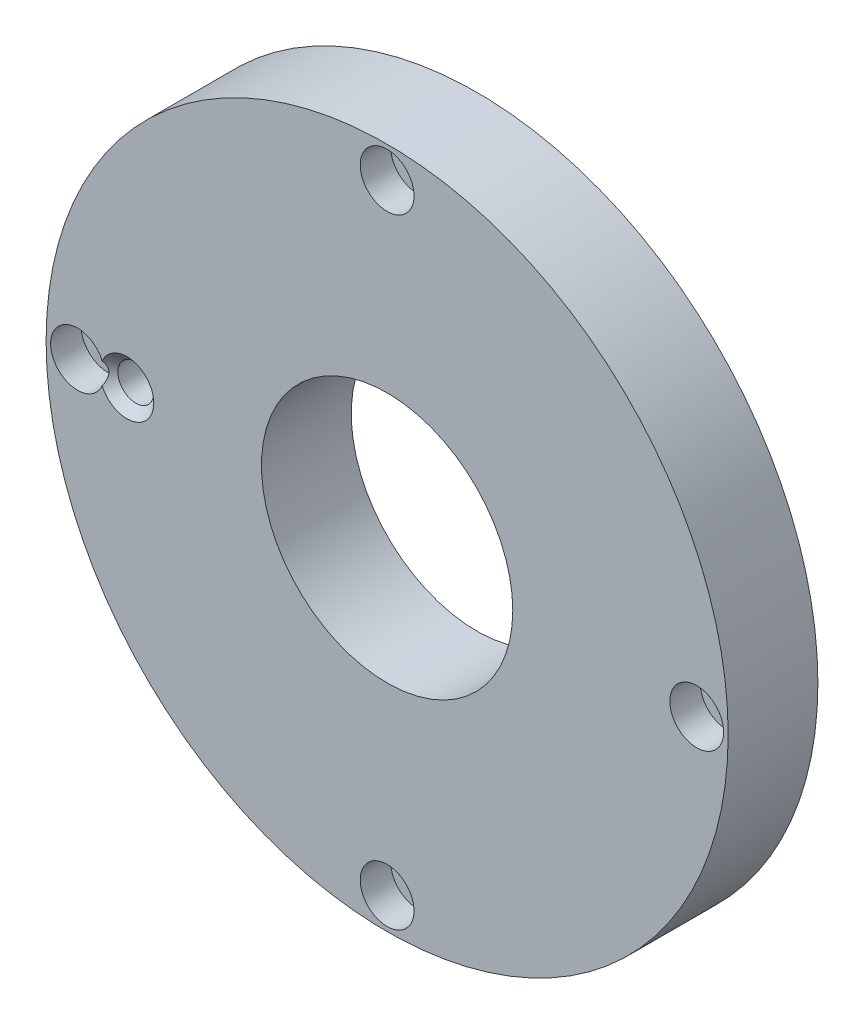
ISO-10303-21;
HEADER;
FILE_DESCRIPTION(('STEP AP214'),'2;1');
FILE_NAME('part.step','',(''),(''),'','','');
FILE_SCHEMA(('AUTOMOTIVE_DESIGN { 1 0 10303 214 1 1 1 1 }'));
ENDSEC;
DATA;
#1=APPLICATION_CONTEXT('core data for automotive mechanical design processes');
#2=APPLICATION_PROTOCOL_DEFINITION('international standard','automotive_design',2000,#1);
#3=PRODUCT_CONTEXT('',#1,'mechanical');
#4=PRODUCT('Part','Part','',(#3));
#5=PRODUCT_RELATED_PRODUCT_CATEGORY('part','',(#4));
#6=PRODUCT_DEFINITION_FORMATION('','',#4);
#7=PRODUCT_DEFINITION_CONTEXT('part definition',#1,'design');
#8=PRODUCT_DEFINITION('design','',#6,#7);
#9=PRODUCT_DEFINITION_SHAPE('','',#8);
#10=(LENGTH_UNIT() NAMED_UNIT(*) SI_UNIT(.MILLI.,.METRE.));
#11=(NAMED_UNIT(*) PLANE_ANGLE_UNIT() SI_UNIT($,.RADIAN.));
#12=(NAMED_UNIT(*) SI_UNIT($,.STERADIAN.) SOLID_ANGLE_UNIT());
#13=UNCERTAINTY_MEASURE_WITH_UNIT(LENGTH_MEASURE(1.E-05),#10,'distance_accuracy_value','');
#14=(GEOMETRIC_REPRESENTATION_CONTEXT(3) GLOBAL_UNCERTAINTY_ASSIGNED_CONTEXT((#13)) GLOBAL_UNIT_ASSIGNED_CONTEXT((#10,
#11,#12)) REPRESENTATION_CONTEXT('',''));
#15=CARTESIAN_POINT('',(0.,0.,0.));
#16=DIRECTION('',(0.,0.,1.));
#17=DIRECTION('',(1.,0.,0.));
#18=AXIS2_PLACEMENT_3D('',#15,#16,#17);
#19=CARTESIAN_POINT('',(0.,0.,9.99999999999999));
#20=DIRECTION('',(0.,0.,1.));
#21=DIRECTION('',(1.,0.,0.));
#22=AXIS2_PLACEMENT_3D('',#19,#20,#21);
#23=PLANE('',#22);
#24=CARTESIAN_POINT('',(0.,34.5,9.99999999999999));
#25=DIRECTION('',(0.,0.,1.));
#26=DIRECTION('',(1.,0.,0.));
#27=AXIS2_PLACEMENT_3D('',#24,#25,#26);
#28=CIRCLE('',#27,3.);
#29=CARTESIAN_POINT('',(2.99999999999999,34.5,9.99999999999999));
#30=VERTEX_POINT('',#29);
#31=EDGE_CURVE('E150',#30,#30,#28,.T.);
#32=ORIENTED_EDGE('',*,*,#31,.F.);
#33=EDGE_LOOP('',(#32));
#34=FACE_BOUND('',#33,.T.);
#35=CARTESIAN_POINT('',(34.5,0.,9.99999999999999));
#36=DIRECTION('',(0.,0.,1.));
#37=DIRECTION('',(1.,0.,0.));
#38=AXIS2_PLACEMENT_3D('',#35,#36,#37);
#39=CIRCLE('',#38,3.);
#40=CARTESIAN_POINT('',(37.5,0.,9.99999999999999));
#41=VERTEX_POINT('',#40);
#42=EDGE_CURVE('E137',#41,#41,#39,.T.);
#43=ORIENTED_EDGE('',*,*,#42,.F.);
#44=EDGE_LOOP('',(#43));
#45=FACE_BOUND('',#44,.T.);
#46=CARTESIAN_POINT('',(0.,-34.5,9.99999999999999));
#47=DIRECTION('',(0.,0.,1.));
#48=DIRECTION('',(1.,0.,0.));
#49=AXIS2_PLACEMENT_3D('',#46,#47,#48);
#50=CIRCLE('',#49,3.);
#51=CARTESIAN_POINT('',(3.,-34.5,9.99999999999999));
#52=VERTEX_POINT('',#51);
#53=EDGE_CURVE('E122',#52,#52,#50,.T.);
#54=ORIENTED_EDGE('',*,*,#53,.F.);
#55=EDGE_LOOP('',(#54));
#56=FACE_BOUND('',#55,.T.);
#57=CARTESIAN_POINT('',(-34.5,0.,9.99999999999999));
#58=DIRECTION('',(0.,0.,1.));
#59=DIRECTION('',(1.,0.,0.));
#60=AXIS2_PLACEMENT_3D('',#57,#58,#59);
#61=CIRCLE('',#60,3.);
#62=CARTESIAN_POINT('',(-31.75,1.19895788082824,9.99999999999999));
#63=VERTEX_POINT('',#62);
#64=CARTESIAN_POINT('',(-31.75,-1.19895788082813,9.99999999999999));
#65=VERTEX_POINT('',#64);
#66=EDGE_CURVE('E73',#63,#65,#61,.T.);
#67=ORIENTED_EDGE('',*,*,#66,.F.);
#68=CARTESIAN_POINT('',(-29.,1.11907385979033E-13,9.99999999999999));
#69=DIRECTION('',(0.,0.,1.));
#70=DIRECTION('',(1.,0.,0.));
#71=AXIS2_PLACEMENT_3D('',#68,#69,#70);
#72=CIRCLE('',#71,3.00000000000001);
#73=EDGE_CURVE('E63',#63,#65,#72,.F.);
#74=ORIENTED_EDGE('',*,*,#73,.T.);
#75=EDGE_LOOP('',(#67,#74));
#76=FACE_BOUND('',#75,.T.);
#77=CARTESIAN_POINT('',(0.,0.,9.99999999999999));
#78=DIRECTION('',(0.,0.,1.));
#79=DIRECTION('',(1.,0.,0.));
#80=AXIS2_PLACEMENT_3D('',#77,#78,#79);
#81=CIRCLE('',#80,38.);
#82=CARTESIAN_POINT('',(38.,0.,9.99999999999999));
#83=VERTEX_POINT('',#82);
#84=EDGE_CURVE('E90',#83,#83,#81,.T.);
#85=ORIENTED_EDGE('',*,*,#84,.T.);
#86=EDGE_LOOP('',(#85));
#87=FACE_BOUND('',#86,.T.);
#88=CARTESIAN_POINT('',(0.,0.,9.99999999999999));
#89=DIRECTION('',(0.,0.,1.));
#90=DIRECTION('',(1.,0.,0.));
#91=AXIS2_PLACEMENT_3D('',#88,#89,#90);
#92=CIRCLE('',#91,14.);
#93=CARTESIAN_POINT('',(14.,0.,9.99999999999999));
#94=VERTEX_POINT('',#93);
#95=EDGE_CURVE('E95',#94,#94,#92,.T.);
#96=ORIENTED_EDGE('',*,*,#95,.F.);
#97=EDGE_LOOP('',(#96));
#98=FACE_BOUND('',#97,.T.);
#99=ADVANCED_FACE('F50',(#34,#45,#56,#76,#87,#98),#23,.T.);
#100=CARTESIAN_POINT('',(0.,0.,0.));
#101=DIRECTION('',(0.,0.,1.));
#102=DIRECTION('',(1.,0.,0.));
#103=AXIS2_PLACEMENT_3D('',#100,#101,#102);
#104=PLANE('',#103);
#105=CARTESIAN_POINT('',(-29.,1.11907385979033E-13,0.));
#106=DIRECTION('',(0.,0.,1.));
#107=DIRECTION('',(1.,0.,0.));
#108=AXIS2_PLACEMENT_3D('',#105,#106,#107);
#109=CIRCLE('',#108,3.);
#110=CARTESIAN_POINT('',(-26.,1.11907385979033E-13,0.));
#111=VERTEX_POINT('',#110);
#112=EDGE_CURVE('E80',#111,#111,#109,.T.);
#113=ORIENTED_EDGE('',*,*,#112,.T.);
#114=EDGE_LOOP('',(#113));
#115=FACE_BOUND('',#114,.T.);
#116=CARTESIAN_POINT('',(0.,34.5,0.));
#117=DIRECTION('',(0.,0.,1.));
#118=DIRECTION('',(1.,0.,0.));
#119=AXIS2_PLACEMENT_3D('',#116,#117,#118);
#120=CIRCLE('',#119,1.6);
#121=CARTESIAN_POINT('',(1.59999999999999,34.5,0.));
#122=VERTEX_POINT('',#121);
#123=EDGE_CURVE('E141',#122,#122,#120,.T.);
#124=ORIENTED_EDGE('',*,*,#123,.T.);
#125=EDGE_LOOP('',(#124));
#126=FACE_BOUND('',#125,.T.);
#127=CARTESIAN_POINT('',(34.5,0.,0.));
#128=DIRECTION('',(0.,0.,1.));
#129=DIRECTION('',(1.,0.,0.));
#130=AXIS2_PLACEMENT_3D('',#127,#128,#129);
#131=CIRCLE('',#130,1.6);
#132=CARTESIAN_POINT('',(36.1,0.,0.));
#133=VERTEX_POINT('',#132);
#134=EDGE_CURVE('E125',#133,#133,#131,.T.);
#135=ORIENTED_EDGE('',*,*,#134,.T.);
#136=EDGE_LOOP('',(#135));
#137=FACE_BOUND('',#136,.T.);
#138=CARTESIAN_POINT('',(0.,-34.5,0.));
#139=DIRECTION('',(0.,0.,1.));
#140=DIRECTION('',(1.,0.,0.));
#141=AXIS2_PLACEMENT_3D('',#138,#139,#140);
#142=CIRCLE('',#141,1.6);
#143=CARTESIAN_POINT('',(1.60000000000001,-34.5,0.));
#144=VERTEX_POINT('',#143);
#145=EDGE_CURVE('E77',#144,#144,#142,.T.);
#146=ORIENTED_EDGE('',*,*,#145,.T.);
#147=EDGE_LOOP('',(#146));
#148=FACE_BOUND('',#147,.T.);
#149=CARTESIAN_POINT('',(-34.5,0.,0.));
#150=DIRECTION('',(0.,0.,1.));
#151=DIRECTION('',(1.,0.,0.));
#152=AXIS2_PLACEMENT_3D('',#149,#150,#151);
#153=CIRCLE('',#152,1.6);
#154=CARTESIAN_POINT('',(-32.9,0.,0.));
#155=VERTEX_POINT('',#154);
#156=EDGE_CURVE('E103',#155,#155,#153,.T.);
#157=ORIENTED_EDGE('',*,*,#156,.T.);
#158=EDGE_LOOP('',(#157));
#159=FACE_BOUND('',#158,.T.);
#160=CARTESIAN_POINT('',(0.,0.,0.));
#161=DIRECTION('',(0.,0.,1.));
#162=DIRECTION('',(1.,0.,0.));
#163=AXIS2_PLACEMENT_3D('',#160,#161,#162);
#164=CIRCLE('',#163,38.);
#165=CARTESIAN_POINT('',(38.,0.,0.));
#166=VERTEX_POINT('',#165);
#167=EDGE_CURVE('E91',#166,#166,#164,.T.);
#168=ORIENTED_EDGE('',*,*,#167,.F.);
#169=EDGE_LOOP('',(#168));
#170=FACE_BOUND('',#169,.T.);
#171=CARTESIAN_POINT('',(0.,0.,0.));
#172=DIRECTION('',(0.,0.,1.));
#173=DIRECTION('',(1.,0.,0.));
#174=AXIS2_PLACEMENT_3D('',#171,#172,#173);
#175=CIRCLE('',#174,14.);
#176=CARTESIAN_POINT('',(14.,0.,0.));
#177=VERTEX_POINT('',#176);
#178=EDGE_CURVE('E99',#177,#177,#175,.T.);
#179=ORIENTED_EDGE('',*,*,#178,.T.);
#180=EDGE_LOOP('',(#179));
#181=FACE_BOUND('',#180,.T.);
#182=ADVANCED_FACE('F158',(#115,#126,#137,#148,#159,#170,#181),#104,.F.);
#183=CARTESIAN_POINT('',(0.,0.,9.99999999999999));
#184=DIRECTION('',(0.,0.,-1.));
#185=DIRECTION('',(-1.,0.,0.));
#186=AXIS2_PLACEMENT_3D('',#183,#184,#185);
#187=CYLINDRICAL_SURFACE('',#186,38.);
#188=ORIENTED_EDGE('',*,*,#84,.F.);
#189=EDGE_LOOP('',(#188));
#190=FACE_BOUND('',#189,.T.);
#191=ORIENTED_EDGE('',*,*,#167,.T.);
#192=EDGE_LOOP('',(#191));
#193=FACE_BOUND('',#192,.T.);
#194=ADVANCED_FACE('F199',(#190,#193),#187,.T.);
#195=CARTESIAN_POINT('',(0.,0.,9.99999999999999));
#196=DIRECTION('',(0.,0.,-1.));
#197=DIRECTION('',(-1.,0.,0.));
#198=AXIS2_PLACEMENT_3D('',#195,#196,#197);
#199=CYLINDRICAL_SURFACE('',#198,14.);
#200=ORIENTED_EDGE('',*,*,#95,.T.);
#201=EDGE_LOOP('',(#200));
#202=FACE_BOUND('',#201,.T.);
#203=ORIENTED_EDGE('',*,*,#178,.F.);
#204=EDGE_LOOP('',(#203));
#205=FACE_BOUND('',#204,.T.);
#206=ADVANCED_FACE('F196',(#202,#205),#199,.F.);
#207=CARTESIAN_POINT('',(-34.5,0.,9.99999999999999));
#208=DIRECTION('',(0.,0.,1.));
#209=DIRECTION('',(1.,0.,0.));
#210=AXIS2_PLACEMENT_3D('',#207,#208,#209);
#211=CYLINDRICAL_SURFACE('',#210,1.6);
#212=ORIENTED_EDGE('',*,*,#156,.F.);
#213=EDGE_LOOP('',(#212));
#214=FACE_BOUND('',#213,.T.);
#215=CARTESIAN_POINT('',(-34.5,0.,6.6));
#216=DIRECTION('',(0.,0.,1.));
#217=DIRECTION('',(1.,0.,0.));
#218=AXIS2_PLACEMENT_3D('',#215,#216,#217);
#219=CIRCLE('',#218,1.6);
#220=CARTESIAN_POINT('',(-32.9,0.,6.6));
#221=VERTEX_POINT('',#220);
#222=EDGE_CURVE('E109',#221,#221,#219,.T.);
#223=ORIENTED_EDGE('',*,*,#222,.T.);
#224=EDGE_LOOP('',(#223));
#225=FACE_BOUND('',#224,.T.);
#226=ADVANCED_FACE('F192',(#214,#225),#211,.F.);
#227=CARTESIAN_POINT('',(-32.9,0.,6.6));
#228=DIRECTION('',(0.,0.,-1.));
#229=DIRECTION('',(-1.,0.,0.));
#230=AXIS2_PLACEMENT_3D('',#227,#228,#229);
#231=PLANE('',#230);
#232=ORIENTED_EDGE('',*,*,#222,.F.);
#233=EDGE_LOOP('',(#232));
#234=FACE_BOUND('',#233,.T.);
#235=CARTESIAN_POINT('',(-34.5,0.,6.6));
#236=DIRECTION('',(0.,0.,1.));
#237=DIRECTION('',(1.,0.,0.));
#238=AXIS2_PLACEMENT_3D('',#235,#236,#237);
#239=CIRCLE('',#238,3.);
#240=CARTESIAN_POINT('',(-31.5,0.,6.6));
#241=VERTEX_POINT('',#240);
#242=EDGE_CURVE('E76',#241,#241,#239,.T.);
#243=ORIENTED_EDGE('',*,*,#242,.T.);
#244=EDGE_LOOP('',(#243));
#245=FACE_BOUND('',#244,.T.);
#246=ADVANCED_FACE('F188',(#234,#245),#231,.F.);
#247=CARTESIAN_POINT('',(-34.5,0.,9.99999999999999));
#248=DIRECTION('',(0.,0.,1.));
#249=DIRECTION('',(1.,0.,0.));
#250=AXIS2_PLACEMENT_3D('',#247,#248,#249);
#251=CYLINDRICAL_SURFACE('',#250,3.);
#252=ORIENTED_EDGE('',*,*,#242,.F.);
#253=EDGE_LOOP('',(#252));
#254=FACE_BOUND('',#253,.T.);
#255=ORIENTED_EDGE('',*,*,#66,.T.);
#256=CARTESIAN_POINT('',(-31.75,-1.19895788082813,9.99999999999999));
#257=CARTESIAN_POINT('',(-31.726282421276,-1.14451031438282,9.95654557875701));
#258=CARTESIAN_POINT('',(-31.703756846476,-1.08847529056734,9.91427618141167));
#259=CARTESIAN_POINT('',(-31.6613033558524,-0.972459980553774,9.83301221437201));
#260=CARTESIAN_POINT('',(-31.6413966642107,-0.912452756905957,9.79404521592145));
#261=CARTESIAN_POINT('',(-31.6043762784548,-0.787215590416863,9.72020955968701));
#262=CARTESIAN_POINT('',(-31.5873317835577,-0.721901135193856,9.68544694628765));
#263=CARTESIAN_POINT('',(-31.5572359413984,-0.587263848906571,9.62308297816465));
#264=CARTESIAN_POINT('',(-31.544171254745,-0.517955355112338,9.59545774895238));
#265=CARTESIAN_POINT('',(-31.5229021367114,-0.376686320745385,9.54998824491058));
#266=CARTESIAN_POINT('',(-31.5146203274923,-0.304789236299476,9.5319886225149));
#267=CARTESIAN_POINT('',(-31.5033458729325,-0.159185095826338,9.50738199903278));
#268=CARTESIAN_POINT('',(-31.500311215712,-0.0854972523727989,9.50068451666226));
#269=CARTESIAN_POINT('',(-31.4997333684147,0.0623648987749194,9.49941356814515));
#270=CARTESIAN_POINT('',(-31.5022164492814,0.136539849993255,9.50489810271766));
#271=CARTESIAN_POINT('',(-31.5124647301429,0.282934587214905,9.52729683383611));
#272=CARTESIAN_POINT('',(-31.5202476362083,0.355146972895448,9.5442493422329));
#273=CARTESIAN_POINT('',(-31.5442627528369,0.522747928883509,9.59572013187333));
#274=CARTESIAN_POINT('',(-31.5625825695954,0.616506932981358,9.63446679842723));
#275=CARTESIAN_POINT('',(-31.6061520191139,0.796413446814046,9.72390617238591));
#276=CARTESIAN_POINT('',(-31.6314212594497,0.882538494590868,9.77463262228639));
#277=CARTESIAN_POINT('',(-31.6733220519029,1.00585132908274,9.85609495327007));
#278=CARTESIAN_POINT('',(-31.6878502614829,1.0457408267745,9.88395053236481));
#279=CARTESIAN_POINT('',(-31.718066062444,1.12364340427253,9.94100947964152));
#280=CARTESIAN_POINT('',(-31.7337452080078,1.16166729097562,9.97020253441909));
#281=CARTESIAN_POINT('',(-31.75,1.19895788082823,9.99999999999999));
#282=B_SPLINE_CURVE_WITH_KNOTS('',3,(#256,#257,#258,#259,#260,#261,#262,#263,#264,#265,#266,
#267,#268,#269,#270,#271,#272,#273,#274,#275,#276,#277,#278,#279,#280,#281),.UNSPECIFIED.,.F.,
.F.,(4,2,2,2,2,2,2,2,2,2,2,2,4),(0.,0.220867171262522,0.443426516246039,0.670767709338738,
0.897338303854697,1.12013258538007,1.34113463504552,1.56319116865907,1.78599322954117,
2.09352361439583,2.401930749334,2.5542078225582,2.70546173989332),.UNSPECIFIED.);
#283=EDGE_CURVE('E13',#65,#63,#282,.T.);
#284=ORIENTED_EDGE('',*,*,#283,.T.);
#285=EDGE_LOOP('',(#255,#284));
#286=FACE_BOUND('',#285,.T.);
#287=ADVANCED_FACE('F72',(#254,#286),#251,.F.);
#288=CARTESIAN_POINT('',(0.,-34.5,9.99999999999999));
#289=DIRECTION('',(0.,0.,1.));
#290=DIRECTION('',(1.,0.,0.));
#291=AXIS2_PLACEMENT_3D('',#288,#289,#290);
#292=CYLINDRICAL_SURFACE('',#291,1.6);
#293=ORIENTED_EDGE('',*,*,#145,.F.);
#294=EDGE_LOOP('',(#293));
#295=FACE_BOUND('',#294,.T.);
#296=CARTESIAN_POINT('',(0.,-34.5,6.6));
#297=DIRECTION('',(0.,0.,1.));
#298=DIRECTION('',(1.,0.,0.));
#299=AXIS2_PLACEMENT_3D('',#296,#297,#298);
#300=CIRCLE('',#299,1.6);
#301=CARTESIAN_POINT('',(1.60000000000001,-34.5,6.6));
#302=VERTEX_POINT('',#301);
#303=EDGE_CURVE('E116',#302,#302,#300,.T.);
#304=ORIENTED_EDGE('',*,*,#303,.T.);
#305=EDGE_LOOP('',(#304));
#306=FACE_BOUND('',#305,.T.);
#307=ADVANCED_FACE('F177',(#295,#306),#292,.F.);
#308=CARTESIAN_POINT('',(1.60000000000001,-34.5,6.6));
#309=DIRECTION('',(0.,0.,-1.));
#310=DIRECTION('',(-1.,0.,0.));
#311=AXIS2_PLACEMENT_3D('',#308,#309,#310);
#312=PLANE('',#311);
#313=ORIENTED_EDGE('',*,*,#303,.F.);
#314=EDGE_LOOP('',(#313));
#315=FACE_BOUND('',#314,.T.);
#316=CARTESIAN_POINT('',(0.,-34.5,6.6));
#317=DIRECTION('',(0.,0.,1.));
#318=DIRECTION('',(1.,0.,0.));
#319=AXIS2_PLACEMENT_3D('',#316,#317,#318);
#320=CIRCLE('',#319,3.);
#321=CARTESIAN_POINT('',(3.,-34.5,6.6));
#322=VERTEX_POINT('',#321);
#323=EDGE_CURVE('E119',#322,#322,#320,.T.);
#324=ORIENTED_EDGE('',*,*,#323,.T.);
#325=EDGE_LOOP('',(#324));
#326=FACE_BOUND('',#325,.T.);
#327=ADVANCED_FACE('F167',(#315,#326),#312,.F.);
#328=CARTESIAN_POINT('',(0.,-34.5,9.99999999999999));
#329=DIRECTION('',(0.,0.,1.));
#330=DIRECTION('',(1.,0.,0.));
#331=AXIS2_PLACEMENT_3D('',#328,#329,#330);
#332=CYLINDRICAL_SURFACE('',#331,3.);
#333=ORIENTED_EDGE('',*,*,#323,.F.);
#334=EDGE_LOOP('',(#333));
#335=FACE_BOUND('',#334,.T.);
#336=ORIENTED_EDGE('',*,*,#53,.T.);
#337=EDGE_LOOP('',(#336));
#338=FACE_BOUND('',#337,.T.);
#339=ADVANCED_FACE('F164',(#335,#338),#332,.F.);
#340=CARTESIAN_POINT('',(34.5,0.,9.99999999999999));
#341=DIRECTION('',(0.,0.,1.));
#342=DIRECTION('',(1.,0.,0.));
#343=AXIS2_PLACEMENT_3D('',#340,#341,#342);
#344=CYLINDRICAL_SURFACE('',#343,1.6);
#345=ORIENTED_EDGE('',*,*,#134,.F.);
#346=EDGE_LOOP('',(#345));
#347=FACE_BOUND('',#346,.T.);
#348=CARTESIAN_POINT('',(34.5,0.,6.6));
#349=DIRECTION('',(0.,0.,1.));
#350=DIRECTION('',(1.,0.,0.));
#351=AXIS2_PLACEMENT_3D('',#348,#349,#350);
#352=CIRCLE('',#351,1.6);
#353=CARTESIAN_POINT('',(36.1,0.,6.6));
#354=VERTEX_POINT('',#353);
#355=EDGE_CURVE('E129',#354,#354,#352,.T.);
#356=ORIENTED_EDGE('',*,*,#355,.T.);
#357=EDGE_LOOP('',(#356));
#358=FACE_BOUND('',#357,.T.);
#359=ADVANCED_FACE('F166',(#347,#358),#344,.F.);
#360=CARTESIAN_POINT('',(36.1,0.,6.6));
#361=DIRECTION('',(0.,0.,-1.));
#362=DIRECTION('',(-1.,0.,0.));
#363=AXIS2_PLACEMENT_3D('',#360,#361,#362);
#364=PLANE('',#363);
#365=ORIENTED_EDGE('',*,*,#355,.F.);
#366=EDGE_LOOP('',(#365));
#367=FACE_BOUND('',#366,.T.);
#368=CARTESIAN_POINT('',(34.5,0.,6.6));
#369=DIRECTION('',(0.,0.,1.));
#370=DIRECTION('',(1.,0.,0.));
#371=AXIS2_PLACEMENT_3D('',#368,#369,#370);
#372=CIRCLE('',#371,3.);
#373=CARTESIAN_POINT('',(37.5,0.,6.6));
#374=VERTEX_POINT('',#373);
#375=EDGE_CURVE('E133',#374,#374,#372,.T.);
#376=ORIENTED_EDGE('',*,*,#375,.T.);
#377=EDGE_LOOP('',(#376));
#378=FACE_BOUND('',#377,.T.);
#379=ADVANCED_FACE('F174',(#367,#378),#364,.F.);
#380=CARTESIAN_POINT('',(34.5,0.,9.99999999999999));
#381=DIRECTION('',(0.,0.,1.));
#382=DIRECTION('',(1.,0.,0.));
#383=AXIS2_PLACEMENT_3D('',#380,#381,#382);
#384=CYLINDRICAL_SURFACE('',#383,3.);
#385=ORIENTED_EDGE('',*,*,#375,.F.);
#386=EDGE_LOOP('',(#385));
#387=FACE_BOUND('',#386,.T.);
#388=ORIENTED_EDGE('',*,*,#42,.T.);
#389=EDGE_LOOP('',(#388));
#390=FACE_BOUND('',#389,.T.);
#391=ADVANCED_FACE('F248',(#387,#390),#384,.F.);
#392=CARTESIAN_POINT('',(0.,34.5,9.99999999999999));
#393=DIRECTION('',(0.,0.,1.));
#394=DIRECTION('',(1.,0.,0.));
#395=AXIS2_PLACEMENT_3D('',#392,#393,#394);
#396=CYLINDRICAL_SURFACE('',#395,1.6);
#397=ORIENTED_EDGE('',*,*,#123,.F.);
#398=EDGE_LOOP('',(#397));
#399=FACE_BOUND('',#398,.T.);
#400=CARTESIAN_POINT('',(0.,34.5,6.6));
#401=DIRECTION('',(0.,0.,1.));
#402=DIRECTION('',(1.,0.,0.));
#403=AXIS2_PLACEMENT_3D('',#400,#401,#402);
#404=CIRCLE('',#403,1.6);
#405=CARTESIAN_POINT('',(1.59999999999999,34.5,6.6));
#406=VERTEX_POINT('',#405);
#407=EDGE_CURVE('E144',#406,#406,#404,.T.);
#408=ORIENTED_EDGE('',*,*,#407,.T.);
#409=EDGE_LOOP('',(#408));
#410=FACE_BOUND('',#409,.T.);
#411=ADVANCED_FACE('F253',(#399,#410),#396,.F.);
#412=CARTESIAN_POINT('',(1.59999999999999,34.5,6.6));
#413=DIRECTION('',(0.,0.,-1.));
#414=DIRECTION('',(-1.,0.,0.));
#415=AXIS2_PLACEMENT_3D('',#412,#413,#414);
#416=PLANE('',#415);
#417=ORIENTED_EDGE('',*,*,#407,.F.);
#418=EDGE_LOOP('',(#417));
#419=FACE_BOUND('',#418,.T.);
#420=CARTESIAN_POINT('',(0.,34.5,6.6));
#421=DIRECTION('',(0.,0.,1.));
#422=DIRECTION('',(1.,0.,0.));
#423=AXIS2_PLACEMENT_3D('',#420,#421,#422);
#424=CIRCLE('',#423,3.);
#425=CARTESIAN_POINT('',(2.99999999999999,34.5,6.6));
#426=VERTEX_POINT('',#425);
#427=EDGE_CURVE('E147',#426,#426,#424,.T.);
#428=ORIENTED_EDGE('',*,*,#427,.T.);
#429=EDGE_LOOP('',(#428));
#430=FACE_BOUND('',#429,.T.);
#431=ADVANCED_FACE('F258',(#419,#430),#416,.F.);
#432=CARTESIAN_POINT('',(0.,34.5,9.99999999999999));
#433=DIRECTION('',(0.,0.,1.));
#434=DIRECTION('',(1.,0.,0.));
#435=AXIS2_PLACEMENT_3D('',#432,#433,#434);
#436=CYLINDRICAL_SURFACE('',#435,3.);
#437=ORIENTED_EDGE('',*,*,#427,.F.);
#438=EDGE_LOOP('',(#437));
#439=FACE_BOUND('',#438,.T.);
#440=ORIENTED_EDGE('',*,*,#31,.T.);
#441=EDGE_LOOP('',(#440));
#442=FACE_BOUND('',#441,.T.);
#443=ADVANCED_FACE('F154',(#439,#442),#436,.F.);
#444=CARTESIAN_POINT('',(-29.,1.11907385979033E-13,0.));
#445=DIRECTION('',(0.,0.,-1.));
#446=DIRECTION('',(-1.,0.,0.));
#447=AXIS2_PLACEMENT_3D('',#444,#445,#446);
#448=CYLINDRICAL_SURFACE('',#447,2.);
#449=CARTESIAN_POINT('',(-29.,1.11907385979033E-13,0.999999999999994));
#450=DIRECTION('',(0.,0.,1.));
#451=DIRECTION('',(1.,0.,0.));
#452=AXIS2_PLACEMENT_3D('',#449,#450,#451);
#453=CIRCLE('',#452,2.);
#454=CARTESIAN_POINT('',(-27.,1.11907385979033E-13,0.999999999999994));
#455=VERTEX_POINT('',#454);
#456=EDGE_CURVE('E82',#455,#455,#453,.F.);
#457=ORIENTED_EDGE('',*,*,#456,.T.);
#458=EDGE_LOOP('',(#457));
#459=FACE_BOUND('',#458,.T.);
#460=CARTESIAN_POINT('',(-29.,1.11907385979033E-13,8.99999999999998));
#461=DIRECTION('',(0.,0.,1.));
#462=DIRECTION('',(1.,0.,0.));
#463=AXIS2_PLACEMENT_3D('',#460,#461,#462);
#464=CIRCLE('',#463,2.);
#465=CARTESIAN_POINT('',(-27.,1.11907385979033E-13,8.99999999999998));
#466=VERTEX_POINT('',#465);
#467=EDGE_CURVE('E87',#466,#466,#464,.T.);
#468=ORIENTED_EDGE('',*,*,#467,.T.);
#469=EDGE_LOOP('',(#468));
#470=FACE_BOUND('',#469,.T.);
#471=ADVANCED_FACE('F209',(#459,#470),#448,.F.);
#472=CARTESIAN_POINT('',(-29.,1.11907385979033E-13,0.999999999999994));
#473=DIRECTION('',(0.,0.,-1.));
#474=DIRECTION('',(-1.,0.,0.));
#475=AXIS2_PLACEMENT_3D('',#472,#473,#474);
#476=CONICAL_SURFACE('',#475,2.,0.785398163397452);
#477=ORIENTED_EDGE('',*,*,#112,.F.);
#478=EDGE_LOOP('',(#477));
#479=FACE_BOUND('',#478,.T.);
#480=ORIENTED_EDGE('',*,*,#456,.F.);
#481=EDGE_LOOP('',(#480));
#482=FACE_BOUND('',#481,.T.);
#483=ADVANCED_FACE('F207',(#479,#482),#476,.F.);
#484=CARTESIAN_POINT('',(-29.,1.11907385979033E-13,8.99999999999998));
#485=DIRECTION('',(0.,0.,1.));
#486=DIRECTION('',(1.,0.,0.));
#487=AXIS2_PLACEMENT_3D('',#484,#485,#486);
#488=CONICAL_SURFACE('',#487,2.,0.785398163397444);
#489=ORIENTED_EDGE('',*,*,#283,.F.);
#490=ORIENTED_EDGE('',*,*,#73,.F.);
#491=EDGE_LOOP('',(#489,#490));
#492=FACE_BOUND('',#491,.T.);
#493=ORIENTED_EDGE('',*,*,#467,.F.);
#494=EDGE_LOOP('',(#493));
#495=FACE_BOUND('',#494,.T.);
#496=ADVANCED_FACE('F52',(#492,#495),#488,.F.);
#497=CLOSED_SHELL('',(#99,#182,#194,#206,#226,#246,#287,#307,#327,#339,#359,#379,#391,#411,#431,
#443,#471,#483,#496));
#498=MANIFOLD_SOLID_BREP('B2',#497);
#499=ADVANCED_BREP_SHAPE_REPRESENTATION('',(#18,#498),#14);
#500=SHAPE_DEFINITION_REPRESENTATION(#9,#499);
ENDSEC;
END-ISO-10303-21;
